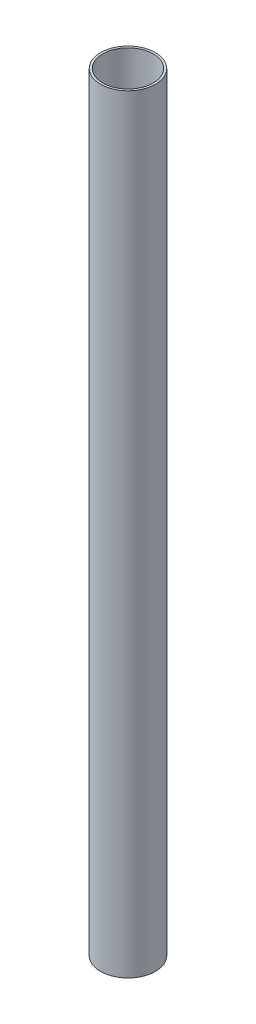
ISO-10303-21;
HEADER;
FILE_DESCRIPTION(('STEP AP214'),'2;1');
FILE_NAME('part.step','',(''),(''),'','','');
FILE_SCHEMA(('AUTOMOTIVE_DESIGN { 1 0 10303 214 1 1 1 1 }'));
ENDSEC;
DATA;
#1=APPLICATION_CONTEXT('core data for automotive mechanical design processes');
#2=APPLICATION_PROTOCOL_DEFINITION('international standard','automotive_design',2000,#1);
#3=PRODUCT_CONTEXT('',#1,'mechanical');
#4=PRODUCT('Part','Part','',(#3));
#5=PRODUCT_RELATED_PRODUCT_CATEGORY('part','',(#4));
#6=PRODUCT_DEFINITION_FORMATION('','',#4);
#7=PRODUCT_DEFINITION_CONTEXT('part definition',#1,'design');
#8=PRODUCT_DEFINITION('design','',#6,#7);
#9=PRODUCT_DEFINITION_SHAPE('','',#8);
#10=(LENGTH_UNIT() NAMED_UNIT(*) SI_UNIT(.MILLI.,.METRE.));
#11=(NAMED_UNIT(*) PLANE_ANGLE_UNIT() SI_UNIT($,.RADIAN.));
#12=(NAMED_UNIT(*) SI_UNIT($,.STERADIAN.) SOLID_ANGLE_UNIT());
#13=UNCERTAINTY_MEASURE_WITH_UNIT(LENGTH_MEASURE(1.E-05),#10,'distance_accuracy_value','');
#14=(GEOMETRIC_REPRESENTATION_CONTEXT(3) GLOBAL_UNCERTAINTY_ASSIGNED_CONTEXT((#13)) GLOBAL_UNIT_ASSIGNED_CONTEXT((#10,
#11,#12)) REPRESENTATION_CONTEXT('',''));
#15=CARTESIAN_POINT('',(0.,0.,0.));
#16=DIRECTION('',(0.,0.,1.));
#17=DIRECTION('',(1.,0.,0.));
#18=AXIS2_PLACEMENT_3D('',#15,#16,#17);
#19=CARTESIAN_POINT('',(0.,350.,0.));
#20=DIRECTION('',(0.,-1.,0.));
#21=DIRECTION('',(0.,0.,-1.));
#22=AXIS2_PLACEMENT_3D('',#19,#20,#21);
#23=CYLINDRICAL_SURFACE('',#22,12.5);
#24=CARTESIAN_POINT('',(0.,350.,0.));
#25=DIRECTION('',(0.,1.,0.));
#26=DIRECTION('',(0.,0.,1.));
#27=AXIS2_PLACEMENT_3D('',#24,#25,#26);
#28=CIRCLE('',#27,12.5);
#29=CARTESIAN_POINT('',(0.,350.,12.5));
#30=VERTEX_POINT('',#29);
#31=EDGE_CURVE('E10',#30,#30,#28,.T.);
#32=ORIENTED_EDGE('',*,*,#31,.F.);
#33=EDGE_LOOP('',(#32));
#34=FACE_BOUND('',#33,.T.);
#35=CARTESIAN_POINT('',(0.,0.,0.));
#36=DIRECTION('',(0.,1.,0.));
#37=DIRECTION('',(0.,0.,1.));
#38=AXIS2_PLACEMENT_3D('',#35,#36,#37);
#39=CIRCLE('',#38,12.5);
#40=CARTESIAN_POINT('',(0.,0.,12.5));
#41=VERTEX_POINT('',#40);
#42=EDGE_CURVE('E40',#41,#41,#39,.T.);
#43=ORIENTED_EDGE('',*,*,#42,.T.);
#44=EDGE_LOOP('',(#43));
#45=FACE_BOUND('',#44,.T.);
#46=ADVANCED_FACE('F37',(#34,#45),#23,.T.);
#47=CARTESIAN_POINT('',(0.,350.,0.));
#48=DIRECTION('',(0.,1.,0.));
#49=DIRECTION('',(0.,0.,1.));
#50=AXIS2_PLACEMENT_3D('',#47,#48,#49);
#51=PLANE('',#50);
#52=CARTESIAN_POINT('',(0.,350.,0.));
#53=DIRECTION('',(0.,-1.,0.));
#54=DIRECTION('',(0.,0.,-1.));
#55=AXIS2_PLACEMENT_3D('',#52,#53,#54);
#56=CIRCLE('',#55,11.5);
#57=CARTESIAN_POINT('',(0.,350.,-11.5));
#58=VERTEX_POINT('',#57);
#59=EDGE_CURVE('E47',#58,#58,#56,.T.);
#60=ORIENTED_EDGE('',*,*,#59,.T.);
#61=EDGE_LOOP('',(#60));
#62=FACE_BOUND('',#61,.T.);
#63=ORIENTED_EDGE('',*,*,#31,.T.);
#64=EDGE_LOOP('',(#63));
#65=FACE_BOUND('',#64,.T.);
#66=ADVANCED_FACE('F55',(#62,#65),#51,.T.);
#67=CARTESIAN_POINT('',(0.,0.,0.));
#68=DIRECTION('',(0.,1.,0.));
#69=DIRECTION('',(0.,0.,1.));
#70=AXIS2_PLACEMENT_3D('',#67,#68,#69);
#71=PLANE('',#70);
#72=CARTESIAN_POINT('',(0.,0.,0.));
#73=DIRECTION('',(0.,-1.,0.));
#74=DIRECTION('',(0.,0.,-1.));
#75=AXIS2_PLACEMENT_3D('',#72,#73,#74);
#76=CIRCLE('',#75,11.5);
#77=CARTESIAN_POINT('',(0.,0.,-11.5));
#78=VERTEX_POINT('',#77);
#79=EDGE_CURVE('E49',#78,#78,#76,.T.);
#80=ORIENTED_EDGE('',*,*,#79,.F.);
#81=EDGE_LOOP('',(#80));
#82=FACE_BOUND('',#81,.T.);
#83=ORIENTED_EDGE('',*,*,#42,.F.);
#84=EDGE_LOOP('',(#83));
#85=FACE_BOUND('',#84,.T.);
#86=ADVANCED_FACE('F60',(#82,#85),#71,.F.);
#87=CARTESIAN_POINT('',(0.,350.,0.));
#88=DIRECTION('',(0.,-1.,0.));
#89=DIRECTION('',(0.,0.,-1.));
#90=AXIS2_PLACEMENT_3D('',#87,#88,#89);
#91=CYLINDRICAL_SURFACE('',#90,11.5);
#92=ORIENTED_EDGE('',*,*,#59,.F.);
#93=EDGE_LOOP('',(#92));
#94=FACE_BOUND('',#93,.T.);
#95=ORIENTED_EDGE('',*,*,#79,.T.);
#96=EDGE_LOOP('',(#95));
#97=FACE_BOUND('',#96,.T.);
#98=ADVANCED_FACE('F57',(#94,#97),#91,.F.);
#99=CLOSED_SHELL('',(#46,#66,#86,#98));
#100=MANIFOLD_SOLID_BREP('B2',#99);
#101=ADVANCED_BREP_SHAPE_REPRESENTATION('',(#18,#100),#14);
#102=SHAPE_DEFINITION_REPRESENTATION(#9,#101);
ENDSEC;
END-ISO-10303-21;
